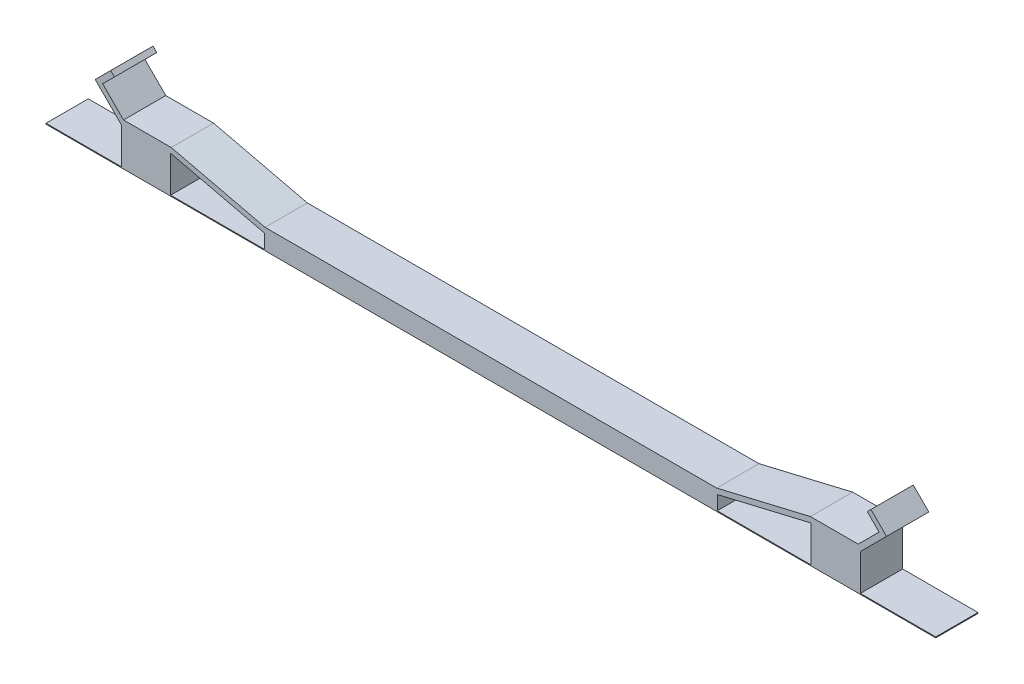
ISO-10303-21;
HEADER;
FILE_DESCRIPTION(('STEP AP214'),'2;1');
FILE_NAME('part.step','',(''),(''),'','','');
FILE_SCHEMA(('AUTOMOTIVE_DESIGN { 1 0 10303 214 1 1 1 1 }'));
ENDSEC;
DATA;
#1=APPLICATION_CONTEXT('core data for automotive mechanical design processes');
#2=APPLICATION_PROTOCOL_DEFINITION('international standard','automotive_design',2000,#1);
#3=PRODUCT_CONTEXT('',#1,'mechanical');
#4=PRODUCT('Part','Part','',(#3));
#5=PRODUCT_RELATED_PRODUCT_CATEGORY('part','',(#4));
#6=PRODUCT_DEFINITION_FORMATION('','',#4);
#7=PRODUCT_DEFINITION_CONTEXT('part definition',#1,'design');
#8=PRODUCT_DEFINITION('design','',#6,#7);
#9=PRODUCT_DEFINITION_SHAPE('','',#8);
#10=(LENGTH_UNIT() NAMED_UNIT(*) SI_UNIT(.MILLI.,.METRE.));
#11=(NAMED_UNIT(*) PLANE_ANGLE_UNIT() SI_UNIT($,.RADIAN.));
#12=(NAMED_UNIT(*) SI_UNIT($,.STERADIAN.) SOLID_ANGLE_UNIT());
#13=UNCERTAINTY_MEASURE_WITH_UNIT(LENGTH_MEASURE(1.E-05),#10,'distance_accuracy_value','');
#14=(GEOMETRIC_REPRESENTATION_CONTEXT(3) GLOBAL_UNCERTAINTY_ASSIGNED_CONTEXT((#13)) GLOBAL_UNIT_ASSIGNED_CONTEXT((#10,
#11,#12)) REPRESENTATION_CONTEXT('',''));
#15=CARTESIAN_POINT('',(0.,0.,0.));
#16=DIRECTION('',(0.,0.,1.));
#17=DIRECTION('',(1.,0.,0.));
#18=AXIS2_PLACEMENT_3D('',#15,#16,#17);
#19=CARTESIAN_POINT('',(0.,1.,0.));
#20=DIRECTION('',(0.,1.,0.));
#21=DIRECTION('',(0.,0.,1.));
#22=AXIS2_PLACEMENT_3D('',#19,#20,#21);
#23=PLANE('',#22);
#24=DIRECTION('',(0.,0.,-1.));
#25=VECTOR('',#24,1.);
#26=CARTESIAN_POINT('',(363.494906847952,1.,24.));
#27=LINE('',#26,#25);
#28=CARTESIAN_POINT('',(363.494906847952,1.,23.9999999999999));
#29=VERTEX_POINT('',#28);
#30=CARTESIAN_POINT('',(363.494906847952,1.,-24.));
#31=VERTEX_POINT('',#30);
#32=EDGE_CURVE('E343',#29,#31,#27,.T.);
#33=ORIENTED_EDGE('',*,*,#32,.T.);
#34=DIRECTION('',(-1.,0.,0.));
#35=VECTOR('',#34,1.);
#36=CARTESIAN_POINT('',(504.999999999999,1.,-24.0000000000001));
#37=LINE('',#36,#35);
#38=CARTESIAN_POINT('',(257.,1.,-24.));
#39=VERTEX_POINT('',#38);
#40=EDGE_CURVE('E453',#31,#39,#37,.T.);
#41=ORIENTED_EDGE('',*,*,#40,.T.);
#42=DIRECTION('',(0.,0.,-1.));
#43=VECTOR('',#42,1.);
#44=CARTESIAN_POINT('',(257.,1.,24.));
#45=LINE('',#44,#43);
#46=CARTESIAN_POINT('',(257.,1.,23.9999999999999));
#47=VERTEX_POINT('',#46);
#48=EDGE_CURVE('E419',#47,#39,#45,.T.);
#49=ORIENTED_EDGE('',*,*,#48,.F.);
#50=DIRECTION('',(1.,0.,0.));
#51=VECTOR('',#50,1.);
#52=CARTESIAN_POINT('',(504.999999999999,1.,23.9999999999999));
#53=LINE('',#52,#51);
#54=EDGE_CURVE('E448',#47,#29,#53,.T.);
#55=ORIENTED_EDGE('',*,*,#54,.T.);
#56=EDGE_LOOP('',(#33,#41,#49,#55));
#57=FACE_BOUND('',#56,.T.);
#58=ADVANCED_FACE('F37',(#57),#23,.T.);
#59=CARTESIAN_POINT('',(-257.,1.,-24.));
#60=VERTEX_POINT('',#59);
#61=CARTESIAN_POINT('',(-363.494906847952,1.,-24.));
#62=VERTEX_POINT('',#61);
#63=EDGE_CURVE('E454',#60,#62,#37,.T.);
#64=ORIENTED_EDGE('',*,*,#63,.T.);
#65=DIRECTION('',(0.,0.,-1.));
#66=VECTOR('',#65,1.);
#67=CARTESIAN_POINT('',(-363.494906847952,1.,24.));
#68=LINE('',#67,#66);
#69=CARTESIAN_POINT('',(-363.494906847952,1.,24.));
#70=VERTEX_POINT('',#69);
#71=EDGE_CURVE('E390',#70,#62,#68,.T.);
#72=ORIENTED_EDGE('',*,*,#71,.F.);
#73=CARTESIAN_POINT('',(-257.,1.,24.));
#74=VERTEX_POINT('',#73);
#75=EDGE_CURVE('E447',#70,#74,#53,.T.);
#76=ORIENTED_EDGE('',*,*,#75,.T.);
#77=DIRECTION('',(0.,0.,1.));
#78=VECTOR('',#77,1.);
#79=CARTESIAN_POINT('',(-257.,1.,24.));
#80=LINE('',#79,#78);
#81=EDGE_CURVE('E414',#60,#74,#80,.T.);
#82=ORIENTED_EDGE('',*,*,#81,.F.);
#83=EDGE_LOOP('',(#64,#72,#76,#82));
#84=FACE_BOUND('',#83,.T.);
#85=ADVANCED_FACE('F574',(#84),#23,.T.);
#86=CARTESIAN_POINT('',(-505.000000000001,1.,24.));
#87=VERTEX_POINT('',#86);
#88=CARTESIAN_POINT('',(-419.494906847952,1.,24.));
#89=VERTEX_POINT('',#88);
#90=EDGE_CURVE('E444',#87,#89,#53,.T.);
#91=ORIENTED_EDGE('',*,*,#90,.T.);
#92=DIRECTION('',(0.,0.,1.));
#93=VECTOR('',#92,1.);
#94=CARTESIAN_POINT('',(-419.494906847952,1.,24.));
#95=LINE('',#94,#93);
#96=CARTESIAN_POINT('',(-419.494906847952,1.,-24.));
#97=VERTEX_POINT('',#96);
#98=EDGE_CURVE('E395',#97,#89,#95,.T.);
#99=ORIENTED_EDGE('',*,*,#98,.F.);
#100=CARTESIAN_POINT('',(-505.000000000001,1.,-24.));
#101=VERTEX_POINT('',#100);
#102=EDGE_CURVE('E450',#97,#101,#37,.T.);
#103=ORIENTED_EDGE('',*,*,#102,.T.);
#104=DIRECTION('',(0.,0.,1.));
#105=VECTOR('',#104,1.);
#106=CARTESIAN_POINT('',(-505.000000000001,1.,24.));
#107=LINE('',#106,#105);
#108=EDGE_CURVE('E439',#101,#87,#107,.T.);
#109=ORIENTED_EDGE('',*,*,#108,.T.);
#110=EDGE_LOOP('',(#91,#99,#103,#109));
#111=FACE_BOUND('',#110,.T.);
#112=ADVANCED_FACE('F483',(#111),#23,.T.);
#113=CARTESIAN_POINT('',(-505.000000000001,1.,24.));
#114=DIRECTION('',(1.,0.,0.));
#115=DIRECTION('',(0.,0.,-1.));
#116=AXIS2_PLACEMENT_3D('',#113,#114,#115);
#117=PLANE('',#116);
#118=DIRECTION('',(0.,0.,1.));
#119=VECTOR('',#118,1.);
#120=CARTESIAN_POINT('',(-505.000000000001,0.,24.));
#121=LINE('',#120,#119);
#122=CARTESIAN_POINT('',(-505.000000000001,0.,-24.));
#123=VERTEX_POINT('',#122);
#124=CARTESIAN_POINT('',(-505.000000000001,0.,24.));
#125=VERTEX_POINT('',#124);
#126=EDGE_CURVE('E438',#123,#125,#121,.T.);
#127=ORIENTED_EDGE('',*,*,#126,.T.);
#128=DIRECTION('',(0.,-1.,0.));
#129=VECTOR('',#128,1.);
#130=CARTESIAN_POINT('',(-505.000000000001,1.,24.));
#131=LINE('',#130,#129);
#132=EDGE_CURVE('E11',#87,#125,#131,.T.);
#133=ORIENTED_EDGE('',*,*,#132,.F.);
#134=ORIENTED_EDGE('',*,*,#108,.F.);
#135=DIRECTION('',(0.,-1.,0.));
#136=VECTOR('',#135,1.);
#137=CARTESIAN_POINT('',(-505.000000000001,1.,-24.));
#138=LINE('',#137,#136);
#139=EDGE_CURVE('E452',#101,#123,#138,.T.);
#140=ORIENTED_EDGE('',*,*,#139,.T.);
#141=EDGE_LOOP('',(#127,#133,#134,#140));
#142=FACE_BOUND('',#141,.T.);
#143=ADVANCED_FACE('F39',(#142),#117,.F.);
#144=CARTESIAN_POINT('',(504.999999999999,1.,23.9999999999999));
#145=DIRECTION('',(0.,0.,-1.));
#146=DIRECTION('',(-1.,0.,0.));
#147=AXIS2_PLACEMENT_3D('',#144,#145,#146);
#148=PLANE('',#147);
#149=DIRECTION('',(0.,-1.,0.));
#150=VECTOR('',#149,1.);
#151=CARTESIAN_POINT('',(257.,17.,24.));
#152=LINE('',#151,#150);
#153=CARTESIAN_POINT('',(257.,17.,24.));
#154=VERTEX_POINT('',#153);
#155=EDGE_CURVE('E432',#154,#47,#152,.T.);
#156=ORIENTED_EDGE('',*,*,#155,.F.);
#157=DIRECTION('',(-0.973126331148455,-0.230271890654391,0.));
#158=VECTOR('',#157,1.);
#159=CARTESIAN_POINT('',(257.,17.,24.));
#160=LINE('',#159,#158);
#161=CARTESIAN_POINT('',(363.494906847952,42.2,24.));
#162=VERTEX_POINT('',#161);
#163=EDGE_CURVE('E313',#162,#154,#160,.T.);
#164=ORIENTED_EDGE('',*,*,#163,.F.);
#165=DIRECTION('',(0.,-1.,0.));
#166=VECTOR('',#165,1.);
#167=CARTESIAN_POINT('',(363.494906847952,42.2,24.));
#168=LINE('',#167,#166);
#169=EDGE_CURVE('E387',#162,#29,#168,.T.);
#170=ORIENTED_EDGE('',*,*,#169,.T.);
#171=ORIENTED_EDGE('',*,*,#54,.F.);
#172=EDGE_LOOP('',(#156,#164,#170,#171));
#173=FACE_BOUND('',#172,.T.);
#174=DIRECTION('',(0.,-1.,0.));
#175=VECTOR('',#174,1.);
#176=CARTESIAN_POINT('',(-363.494906847952,42.2,24.));
#177=LINE('',#176,#175);
#178=CARTESIAN_POINT('',(-363.494906847952,42.2,24.));
#179=VERTEX_POINT('',#178);
#180=EDGE_CURVE('E398',#179,#70,#177,.T.);
#181=ORIENTED_EDGE('',*,*,#180,.F.);
#182=DIRECTION('',(-0.973126331148455,0.230271890654391,0.));
#183=VECTOR('',#182,1.);
#184=CARTESIAN_POINT('',(-363.494906847952,42.2,24.));
#185=LINE('',#184,#183);
#186=CARTESIAN_POINT('',(-257.,17.,24.));
#187=VERTEX_POINT('',#186);
#188=EDGE_CURVE('E310',#187,#179,#185,.T.);
#189=ORIENTED_EDGE('',*,*,#188,.F.);
#190=DIRECTION('',(0.,-1.,0.));
#191=VECTOR('',#190,1.);
#192=CARTESIAN_POINT('',(-257.,17.,24.));
#193=LINE('',#192,#191);
#194=EDGE_CURVE('E435',#187,#74,#193,.T.);
#195=ORIENTED_EDGE('',*,*,#194,.T.);
#196=ORIENTED_EDGE('',*,*,#75,.F.);
#197=EDGE_LOOP('',(#181,#189,#195,#196));
#198=FACE_BOUND('',#197,.T.);
#199=DIRECTION('',(-0.707106781186548,0.707106781186547,0.));
#200=VECTOR('',#199,1.);
#201=CARTESIAN_POINT('',(-419.494906847952,42.2,24.));
#202=LINE('',#201,#200);
#203=CARTESIAN_POINT('',(-419.494906847952,42.2,24.));
#204=VERTEX_POINT('',#203);
#205=CARTESIAN_POINT('',(-449.193391657787,71.898484809835,24.));
#206=VERTEX_POINT('',#205);
#207=EDGE_CURVE('E308',#204,#206,#202,.T.);
#208=ORIENTED_EDGE('',*,*,#207,.F.);
#209=DIRECTION('',(0.,-1.,0.));
#210=VECTOR('',#209,1.);
#211=CARTESIAN_POINT('',(-419.494906847952,42.2,24.));
#212=LINE('',#211,#210);
#213=EDGE_CURVE('E405',#204,#89,#212,.T.);
#214=ORIENTED_EDGE('',*,*,#213,.T.);
#215=ORIENTED_EDGE('',*,*,#90,.F.);
#216=ORIENTED_EDGE('',*,*,#132,.T.);
#217=DIRECTION('',(1.,0.,0.));
#218=VECTOR('',#217,1.);
#219=CARTESIAN_POINT('',(504.999999999999,0.,23.9999999999999));
#220=LINE('',#219,#218);
#221=CARTESIAN_POINT('',(504.999999999999,0.,23.9999999999999));
#222=VERTEX_POINT('',#221);
#223=EDGE_CURVE('E457',#125,#222,#220,.T.);
#224=ORIENTED_EDGE('',*,*,#223,.T.);
#225=DIRECTION('',(0.,-1.,0.));
#226=VECTOR('',#225,1.);
#227=CARTESIAN_POINT('',(504.999999999999,1.,23.9999999999999));
#228=LINE('',#227,#226);
#229=CARTESIAN_POINT('',(504.999999999999,1.,23.9999999999999));
#230=VERTEX_POINT('',#229);
#231=EDGE_CURVE('E45',#230,#222,#228,.T.);
#232=ORIENTED_EDGE('',*,*,#231,.F.);
#233=CARTESIAN_POINT('',(419.494906847952,1.,23.9999999999999));
#234=VERTEX_POINT('',#233);
#235=EDGE_CURVE('E442',#234,#230,#53,.T.);
#236=ORIENTED_EDGE('',*,*,#235,.F.);
#237=DIRECTION('',(0.,-1.,0.));
#238=VECTOR('',#237,1.);
#239=CARTESIAN_POINT('',(419.494906847952,42.2,24.));
#240=LINE('',#239,#238);
#241=CARTESIAN_POINT('',(419.494906847952,42.2,24.));
#242=VERTEX_POINT('',#241);
#243=EDGE_CURVE('E384',#242,#234,#240,.T.);
#244=ORIENTED_EDGE('',*,*,#243,.F.);
#245=DIRECTION('',(-0.707106781186546,-0.707106781186549,0.));
#246=VECTOR('',#245,1.);
#247=CARTESIAN_POINT('',(419.494906847952,42.2,24.));
#248=LINE('',#247,#246);
#249=CARTESIAN_POINT('',(449.193391657787,71.898484809835,24.));
#250=VERTEX_POINT('',#249);
#251=EDGE_CURVE('E316',#250,#242,#248,.T.);
#252=ORIENTED_EDGE('',*,*,#251,.F.);
#253=DIRECTION('',(0.707106781186549,-0.707106781186546,0.));
#254=VECTOR('',#253,1.);
#255=CARTESIAN_POINT('',(449.193391657787,71.898484809835,24.));
#256=LINE('',#255,#254);
#257=CARTESIAN_POINT('',(431.515722128123,89.5761543394986,24.));
#258=VERTEX_POINT('',#257);
#259=EDGE_CURVE('E318',#258,#250,#256,.T.);
#260=ORIENTED_EDGE('',*,*,#259,.F.);
#261=DIRECTION('',(0.707106781186545,0.70710678118655,0.));
#262=VECTOR('',#261,1.);
#263=CARTESIAN_POINT('',(427.273081441004,85.3335136523793,24.));
#264=LINE('',#263,#262);
#265=CARTESIAN_POINT('',(427.273081441004,85.3335136523793,24.));
#266=VERTEX_POINT('',#265);
#267=EDGE_CURVE('E320',#266,#258,#264,.T.);
#268=ORIENTED_EDGE('',*,*,#267,.F.);
#269=DIRECTION('',(0.707106781186549,-0.707106781186546,0.));
#270=VECTOR('',#269,1.);
#271=CARTESIAN_POINT('',(444.950750970667,67.6558441227157,24.));
#272=LINE('',#271,#270);
#273=CARTESIAN_POINT('',(440.708110283548,71.898484809835,24.));
#274=VERTEX_POINT('',#273);
#275=EDGE_CURVE('E322',#266,#274,#272,.T.);
#276=ORIENTED_EDGE('',*,*,#275,.T.);
#277=DIRECTION('',(-0.707106781186546,-0.707106781186549,0.));
#278=VECTOR('',#277,1.);
#279=CARTESIAN_POINT('',(415.252266160832,46.4426406871193,24.));
#280=LINE('',#279,#278);
#281=CARTESIAN_POINT('',(417.009625473713,48.2,24.));
#282=VERTEX_POINT('',#281);
#283=EDGE_CURVE('E325',#274,#282,#280,.T.);
#284=ORIENTED_EDGE('',*,*,#283,.T.);
#285=DIRECTION('',(1.,0.,0.));
#286=VECTOR('',#285,1.);
#287=CARTESIAN_POINT('',(363.494906847952,48.2,24.));
#288=LINE('',#287,#286);
#289=CARTESIAN_POINT('',(362.794682375694,48.2,24.));
#290=VERTEX_POINT('',#289);
#291=EDGE_CURVE('E328',#282,#290,#288,.F.);
#292=ORIENTED_EDGE('',*,*,#291,.T.);
#293=DIRECTION('',(-0.973126331148455,-0.230271890654391,0.));
#294=VECTOR('',#293,1.);
#295=CARTESIAN_POINT('',(255.618368656074,22.8387579868907,24.));
#296=LINE('',#295,#294);
#297=CARTESIAN_POINT('',(256.299775527742,23.,24.));
#298=VERTEX_POINT('',#297);
#299=EDGE_CURVE('E331',#290,#298,#296,.T.);
#300=ORIENTED_EDGE('',*,*,#299,.T.);
#301=DIRECTION('',(1.,0.,0.));
#302=VECTOR('',#301,1.);
#303=CARTESIAN_POINT('',(-257.,23.,24.));
#304=LINE('',#303,#302);
#305=CARTESIAN_POINT('',(-256.299775527742,23.,24.));
#306=VERTEX_POINT('',#305);
#307=EDGE_CURVE('E334',#298,#306,#304,.F.);
#308=ORIENTED_EDGE('',*,*,#307,.T.);
#309=DIRECTION('',(-0.973126331148455,0.230271890654391,0.));
#310=VECTOR('',#309,1.);
#311=CARTESIAN_POINT('',(-362.113275504025,48.0387579868907,24.));
#312=LINE('',#311,#310);
#313=CARTESIAN_POINT('',(-362.794682375694,48.2,24.));
#314=VERTEX_POINT('',#313);
#315=EDGE_CURVE('E337',#306,#314,#312,.T.);
#316=ORIENTED_EDGE('',*,*,#315,.T.);
#317=DIRECTION('',(1.,0.,0.));
#318=VECTOR('',#317,1.);
#319=CARTESIAN_POINT('',(-419.494906847952,48.2,24.));
#320=LINE('',#319,#318);
#321=CARTESIAN_POINT('',(-417.009625473713,48.2,24.));
#322=VERTEX_POINT('',#321);
#323=EDGE_CURVE('E263',#314,#322,#320,.F.);
#324=ORIENTED_EDGE('',*,*,#323,.T.);
#325=DIRECTION('',(-0.707106781186548,0.707106781186547,0.));
#326=VECTOR('',#325,1.);
#327=CARTESIAN_POINT('',(-415.252266160832,46.4426406871193,24.));
#328=LINE('',#327,#326);
#329=CARTESIAN_POINT('',(-440.708110283548,71.898484809835,24.));
#330=VERTEX_POINT('',#329);
#331=EDGE_CURVE('E260',#322,#330,#328,.T.);
#332=ORIENTED_EDGE('',*,*,#331,.T.);
#333=DIRECTION('',(0.707106781186549,0.707106781186546,0.));
#334=VECTOR('',#333,1.);
#335=CARTESIAN_POINT('',(-444.950750970667,67.6558441227157,24.));
#336=LINE('',#335,#334);
#337=CARTESIAN_POINT('',(-427.273081441004,85.3335136523794,24.));
#338=VERTEX_POINT('',#337);
#339=EDGE_CURVE('E303',#330,#338,#336,.T.);
#340=ORIENTED_EDGE('',*,*,#339,.T.);
#341=DIRECTION('',(0.707106781186545,-0.70710678118655,0.));
#342=VECTOR('',#341,1.);
#343=CARTESIAN_POINT('',(-431.515722128123,89.5761543394987,24.));
#344=LINE('',#343,#342);
#345=CARTESIAN_POINT('',(-431.515722128123,89.5761543394987,24.));
#346=VERTEX_POINT('',#345);
#347=EDGE_CURVE('E251',#346,#338,#344,.T.);
#348=ORIENTED_EDGE('',*,*,#347,.F.);
#349=DIRECTION('',(0.707106781186549,0.707106781186546,0.));
#350=VECTOR('',#349,1.);
#351=CARTESIAN_POINT('',(-449.193391657787,71.898484809835,24.));
#352=LINE('',#351,#350);
#353=EDGE_CURVE('E306',#206,#346,#352,.T.);
#354=ORIENTED_EDGE('',*,*,#353,.F.);
#355=EDGE_LOOP('',(#208,#214,#215,#216,#224,#232,#236,#244,#252,#260,#268,#276,#284,#292,#300,
#308,#316,#324,#332,#340,#348,#354));
#356=FACE_BOUND('',#355,.T.);
#357=ADVANCED_FACE('F496',(#173,#198,#356),#148,.F.);
#358=CARTESIAN_POINT('',(504.999999999999,1.,23.9999999999999));
#359=DIRECTION('',(-1.,0.,0.));
#360=DIRECTION('',(0.,0.,1.));
#361=AXIS2_PLACEMENT_3D('',#358,#359,#360);
#362=PLANE('',#361);
#363=DIRECTION('',(0.,0.,-1.));
#364=VECTOR('',#363,1.);
#365=CARTESIAN_POINT('',(504.999999999999,0.,23.9999999999999));
#366=LINE('',#365,#364);
#367=CARTESIAN_POINT('',(504.999999999999,0.,-24.0000000000001));
#368=VERTEX_POINT('',#367);
#369=EDGE_CURVE('E459',#222,#368,#366,.T.);
#370=ORIENTED_EDGE('',*,*,#369,.T.);
#371=DIRECTION('',(0.,-1.,0.));
#372=VECTOR('',#371,1.);
#373=CARTESIAN_POINT('',(504.999999999999,1.,-24.0000000000001));
#374=LINE('',#373,#372);
#375=CARTESIAN_POINT('',(504.999999999999,1.,-24.0000000000001));
#376=VERTEX_POINT('',#375);
#377=EDGE_CURVE('E464',#376,#368,#374,.T.);
#378=ORIENTED_EDGE('',*,*,#377,.F.);
#379=DIRECTION('',(0.,0.,-1.));
#380=VECTOR('',#379,1.);
#381=CARTESIAN_POINT('',(504.999999999999,1.,23.9999999999999));
#382=LINE('',#381,#380);
#383=EDGE_CURVE('E446',#230,#376,#382,.T.);
#384=ORIENTED_EDGE('',*,*,#383,.F.);
#385=ORIENTED_EDGE('',*,*,#231,.T.);
#386=EDGE_LOOP('',(#370,#378,#384,#385));
#387=FACE_BOUND('',#386,.T.);
#388=ADVANCED_FACE('F471',(#387),#362,.F.);
#389=CARTESIAN_POINT('',(504.999999999999,1.,-24.0000000000001));
#390=DIRECTION('',(0.,0.,1.));
#391=DIRECTION('',(1.,0.,0.));
#392=AXIS2_PLACEMENT_3D('',#389,#390,#391);
#393=PLANE('',#392);
#394=DIRECTION('',(0.,-1.,0.));
#395=VECTOR('',#394,1.);
#396=CARTESIAN_POINT('',(-257.,17.,-24.));
#397=LINE('',#396,#395);
#398=CARTESIAN_POINT('',(-257.,17.,-24.));
#399=VERTEX_POINT('',#398);
#400=EDGE_CURVE('E422',#399,#60,#397,.T.);
#401=ORIENTED_EDGE('',*,*,#400,.F.);
#402=DIRECTION('',(-0.973126331148455,0.230271890654391,0.));
#403=VECTOR('',#402,1.);
#404=CARTESIAN_POINT('',(-363.494906847952,42.2,-24.));
#405=LINE('',#404,#403);
#406=CARTESIAN_POINT('',(-363.494906847952,42.2,-24.));
#407=VERTEX_POINT('',#406);
#408=EDGE_CURVE('E269',#399,#407,#405,.T.);
#409=ORIENTED_EDGE('',*,*,#408,.T.);
#410=DIRECTION('',(0.,-1.,0.));
#411=VECTOR('',#410,1.);
#412=CARTESIAN_POINT('',(-363.494906847952,42.2,-24.));
#413=LINE('',#412,#411);
#414=EDGE_CURVE('E411',#407,#62,#413,.T.);
#415=ORIENTED_EDGE('',*,*,#414,.T.);
#416=ORIENTED_EDGE('',*,*,#63,.F.);
#417=EDGE_LOOP('',(#401,#409,#415,#416));
#418=FACE_BOUND('',#417,.T.);
#419=DIRECTION('',(0.,-1.,0.));
#420=VECTOR('',#419,1.);
#421=CARTESIAN_POINT('',(-419.494906847952,42.2,-24.));
#422=LINE('',#421,#420);
#423=CARTESIAN_POINT('',(-419.494906847952,42.2,-24.));
#424=VERTEX_POINT('',#423);
#425=EDGE_CURVE('E408',#424,#97,#422,.T.);
#426=ORIENTED_EDGE('',*,*,#425,.F.);
#427=DIRECTION('',(-0.707106781186548,0.707106781186547,0.));
#428=VECTOR('',#427,1.);
#429=CARTESIAN_POINT('',(-419.494906847952,42.2,-24.));
#430=LINE('',#429,#428);
#431=CARTESIAN_POINT('',(-449.193391657787,71.898484809835,-24.));
#432=VERTEX_POINT('',#431);
#433=EDGE_CURVE('E267',#424,#432,#430,.T.);
#434=ORIENTED_EDGE('',*,*,#433,.T.);
#435=DIRECTION('',(0.707106781186549,0.707106781186546,0.));
#436=VECTOR('',#435,1.);
#437=CARTESIAN_POINT('',(-449.193391657787,71.898484809835,-24.));
#438=LINE('',#437,#436);
#439=CARTESIAN_POINT('',(-431.515722128123,89.5761543394987,-24.));
#440=VERTEX_POINT('',#439);
#441=EDGE_CURVE('E242',#432,#440,#438,.T.);
#442=ORIENTED_EDGE('',*,*,#441,.T.);
#443=DIRECTION('',(0.707106781186545,-0.70710678118655,0.));
#444=VECTOR('',#443,1.);
#445=CARTESIAN_POINT('',(-431.515722128123,89.5761543394987,-24.));
#446=LINE('',#445,#444);
#447=CARTESIAN_POINT('',(-427.273081441004,85.3335136523794,-24.));
#448=VERTEX_POINT('',#447);
#449=EDGE_CURVE('E233',#440,#448,#446,.T.);
#450=ORIENTED_EDGE('',*,*,#449,.T.);
#451=DIRECTION('',(0.707106781186549,0.707106781186546,0.));
#452=VECTOR('',#451,1.);
#453=CARTESIAN_POINT('',(-444.950750970667,67.6558441227157,-24.));
#454=LINE('',#453,#452);
#455=CARTESIAN_POINT('',(-440.708110283548,71.898484809835,-24.));
#456=VERTEX_POINT('',#455);
#457=EDGE_CURVE('E239',#456,#448,#454,.T.);
#458=ORIENTED_EDGE('',*,*,#457,.F.);
#459=DIRECTION('',(-0.707106781186548,0.707106781186547,0.));
#460=VECTOR('',#459,1.);
#461=CARTESIAN_POINT('',(-415.252266160832,46.4426406871193,-24.));
#462=LINE('',#461,#460);
#463=CARTESIAN_POINT('',(-417.009625473713,48.2,-24.));
#464=VERTEX_POINT('',#463);
#465=EDGE_CURVE('E256',#464,#456,#462,.T.);
#466=ORIENTED_EDGE('',*,*,#465,.F.);
#467=DIRECTION('',(1.,0.,0.));
#468=VECTOR('',#467,1.);
#469=CARTESIAN_POINT('',(-419.494906847952,48.2,-24.));
#470=LINE('',#469,#468);
#471=CARTESIAN_POINT('',(-362.794682375694,48.2,-24.));
#472=VERTEX_POINT('',#471);
#473=EDGE_CURVE('E299',#472,#464,#470,.F.);
#474=ORIENTED_EDGE('',*,*,#473,.F.);
#475=DIRECTION('',(-0.973126331148455,0.230271890654391,0.));
#476=VECTOR('',#475,1.);
#477=CARTESIAN_POINT('',(-362.113275504025,48.0387579868907,-24.));
#478=LINE('',#477,#476);
#479=CARTESIAN_POINT('',(-256.299775527742,23.,-24.));
#480=VERTEX_POINT('',#479);
#481=EDGE_CURVE('E296',#480,#472,#478,.T.);
#482=ORIENTED_EDGE('',*,*,#481,.F.);
#483=DIRECTION('',(1.,0.,0.));
#484=VECTOR('',#483,1.);
#485=CARTESIAN_POINT('',(-257.,23.,-24.));
#486=LINE('',#485,#484);
#487=CARTESIAN_POINT('',(256.299775527742,23.,-24.));
#488=VERTEX_POINT('',#487);
#489=EDGE_CURVE('E293',#488,#480,#486,.F.);
#490=ORIENTED_EDGE('',*,*,#489,.F.);
#491=DIRECTION('',(-0.973126331148455,-0.230271890654391,0.));
#492=VECTOR('',#491,1.);
#493=CARTESIAN_POINT('',(255.618368656074,22.8387579868907,-24.));
#494=LINE('',#493,#492);
#495=CARTESIAN_POINT('',(362.794682375694,48.2,-24.));
#496=VERTEX_POINT('',#495);
#497=EDGE_CURVE('E290',#496,#488,#494,.T.);
#498=ORIENTED_EDGE('',*,*,#497,.F.);
#499=DIRECTION('',(1.,0.,0.));
#500=VECTOR('',#499,1.);
#501=CARTESIAN_POINT('',(363.494906847952,48.2,-24.));
#502=LINE('',#501,#500);
#503=CARTESIAN_POINT('',(417.009625473713,48.2,-24.));
#504=VERTEX_POINT('',#503);
#505=EDGE_CURVE('E287',#504,#496,#502,.F.);
#506=ORIENTED_EDGE('',*,*,#505,.F.);
#507=DIRECTION('',(-0.707106781186546,-0.707106781186549,0.));
#508=VECTOR('',#507,1.);
#509=CARTESIAN_POINT('',(415.252266160832,46.4426406871193,-24.));
#510=LINE('',#509,#508);
#511=CARTESIAN_POINT('',(440.708110283548,71.898484809835,-24.));
#512=VERTEX_POINT('',#511);
#513=EDGE_CURVE('E284',#512,#504,#510,.T.);
#514=ORIENTED_EDGE('',*,*,#513,.F.);
#515=DIRECTION('',(0.707106781186549,-0.707106781186546,0.));
#516=VECTOR('',#515,1.);
#517=CARTESIAN_POINT('',(444.950750970667,67.6558441227157,-24.));
#518=LINE('',#517,#516);
#519=CARTESIAN_POINT('',(427.273081441004,85.3335136523793,-24.));
#520=VERTEX_POINT('',#519);
#521=EDGE_CURVE('E281',#520,#512,#518,.T.);
#522=ORIENTED_EDGE('',*,*,#521,.F.);
#523=DIRECTION('',(0.707106781186545,0.70710678118655,0.));
#524=VECTOR('',#523,1.);
#525=CARTESIAN_POINT('',(427.273081441004,85.3335136523793,-24.));
#526=LINE('',#525,#524);
#527=CARTESIAN_POINT('',(431.515722128123,89.5761543394986,-24.));
#528=VERTEX_POINT('',#527);
#529=EDGE_CURVE('E279',#520,#528,#526,.T.);
#530=ORIENTED_EDGE('',*,*,#529,.T.);
#531=DIRECTION('',(0.707106781186549,-0.707106781186546,0.));
#532=VECTOR('',#531,1.);
#533=CARTESIAN_POINT('',(449.193391657787,71.898484809835,-24.));
#534=LINE('',#533,#532);
#535=CARTESIAN_POINT('',(449.193391657787,71.898484809835,-24.));
#536=VERTEX_POINT('',#535);
#537=EDGE_CURVE('E277',#528,#536,#534,.T.);
#538=ORIENTED_EDGE('',*,*,#537,.T.);
#539=DIRECTION('',(-0.707106781186546,-0.707106781186549,0.));
#540=VECTOR('',#539,1.);
#541=CARTESIAN_POINT('',(419.494906847952,42.2,-24.));
#542=LINE('',#541,#540);
#543=CARTESIAN_POINT('',(419.494906847952,42.2,-24.));
#544=VERTEX_POINT('',#543);
#545=EDGE_CURVE('E275',#536,#544,#542,.T.);
#546=ORIENTED_EDGE('',*,*,#545,.T.);
#547=DIRECTION('',(0.,-1.,0.));
#548=VECTOR('',#547,1.);
#549=CARTESIAN_POINT('',(419.494906847952,42.2,-24.));
#550=LINE('',#549,#548);
#551=CARTESIAN_POINT('',(419.494906847952,1.,-24.0000000000001));
#552=VERTEX_POINT('',#551);
#553=EDGE_CURVE('E382',#544,#552,#550,.T.);
#554=ORIENTED_EDGE('',*,*,#553,.T.);
#555=EDGE_CURVE('E52',#376,#552,#37,.T.);
#556=ORIENTED_EDGE('',*,*,#555,.F.);
#557=ORIENTED_EDGE('',*,*,#377,.T.);
#558=DIRECTION('',(-1.,0.,0.));
#559=VECTOR('',#558,1.);
#560=CARTESIAN_POINT('',(504.999999999999,0.,-24.0000000000001));
#561=LINE('',#560,#559);
#562=EDGE_CURVE('E443',#368,#123,#561,.T.);
#563=ORIENTED_EDGE('',*,*,#562,.T.);
#564=ORIENTED_EDGE('',*,*,#139,.F.);
#565=ORIENTED_EDGE('',*,*,#102,.F.);
#566=EDGE_LOOP('',(#426,#434,#442,#450,#458,#466,#474,#482,#490,#498,#506,#514,#522,#530,#538,
#546,#554,#556,#557,#563,#564,#565));
#567=FACE_BOUND('',#566,.T.);
#568=DIRECTION('',(-0.973126331148455,-0.230271890654391,0.));
#569=VECTOR('',#568,1.);
#570=CARTESIAN_POINT('',(257.,17.,-24.));
#571=LINE('',#570,#569);
#572=CARTESIAN_POINT('',(363.494906847952,42.2,-24.));
#573=VERTEX_POINT('',#572);
#574=CARTESIAN_POINT('',(257.,17.,-24.));
#575=VERTEX_POINT('',#574);
#576=EDGE_CURVE('E272',#573,#575,#571,.T.);
#577=ORIENTED_EDGE('',*,*,#576,.T.);
#578=DIRECTION('',(0.,-1.,0.));
#579=VECTOR('',#578,1.);
#580=CARTESIAN_POINT('',(257.,17.,-24.));
#581=LINE('',#580,#579);
#582=EDGE_CURVE('E429',#575,#39,#581,.T.);
#583=ORIENTED_EDGE('',*,*,#582,.T.);
#584=ORIENTED_EDGE('',*,*,#40,.F.);
#585=DIRECTION('',(0.,-1.,0.));
#586=VECTOR('',#585,1.);
#587=CARTESIAN_POINT('',(363.494906847952,42.2,-24.));
#588=LINE('',#587,#586);
#589=EDGE_CURVE('E376',#573,#31,#588,.T.);
#590=ORIENTED_EDGE('',*,*,#589,.F.);
#591=EDGE_LOOP('',(#577,#583,#584,#590));
#592=FACE_BOUND('',#591,.T.);
#593=ADVANCED_FACE('F235',(#418,#567,#592),#393,.F.);
#594=DIRECTION('',(0.,0.,1.));
#595=VECTOR('',#594,1.);
#596=CARTESIAN_POINT('',(419.494906847952,1.,24.));
#597=LINE('',#596,#595);
#598=EDGE_CURVE('E57',#552,#234,#597,.T.);
#599=ORIENTED_EDGE('',*,*,#598,.T.);
#600=ORIENTED_EDGE('',*,*,#235,.T.);
#601=ORIENTED_EDGE('',*,*,#383,.T.);
#602=ORIENTED_EDGE('',*,*,#555,.T.);
#603=EDGE_LOOP('',(#599,#600,#601,#602));
#604=FACE_BOUND('',#603,.T.);
#605=ADVANCED_FACE('F499',(#604),#23,.T.);
#606=CARTESIAN_POINT('',(0.,0.,0.));
#607=DIRECTION('',(0.,1.,0.));
#608=DIRECTION('',(0.,0.,1.));
#609=AXIS2_PLACEMENT_3D('',#606,#607,#608);
#610=PLANE('',#609);
#611=ORIENTED_EDGE('',*,*,#126,.F.);
#612=ORIENTED_EDGE('',*,*,#562,.F.);
#613=ORIENTED_EDGE('',*,*,#369,.F.);
#614=ORIENTED_EDGE('',*,*,#223,.F.);
#615=EDGE_LOOP('',(#611,#612,#613,#614));
#616=FACE_BOUND('',#615,.T.);
#617=ADVANCED_FACE('F477',(#616),#610,.F.);
#618=CARTESIAN_POINT('',(-257.,17.,24.));
#619=DIRECTION('',(1.,0.,0.));
#620=DIRECTION('',(0.,0.,-1.));
#621=AXIS2_PLACEMENT_3D('',#618,#619,#620);
#622=PLANE('',#621);
#623=ORIENTED_EDGE('',*,*,#81,.T.);
#624=ORIENTED_EDGE('',*,*,#194,.F.);
#625=DIRECTION('',(0.,0.,1.));
#626=VECTOR('',#625,1.);
#627=CARTESIAN_POINT('',(-257.,17.,24.));
#628=LINE('',#627,#626);
#629=EDGE_CURVE('E415',#399,#187,#628,.T.);
#630=ORIENTED_EDGE('',*,*,#629,.F.);
#631=ORIENTED_EDGE('',*,*,#400,.T.);
#632=EDGE_LOOP('',(#623,#624,#630,#631));
#633=FACE_BOUND('',#632,.T.);
#634=ADVANCED_FACE('F587',(#633),#622,.F.);
#635=CARTESIAN_POINT('',(257.,17.,24.));
#636=DIRECTION('',(-1.,0.,0.));
#637=DIRECTION('',(0.,0.,1.));
#638=AXIS2_PLACEMENT_3D('',#635,#636,#637);
#639=PLANE('',#638);
#640=ORIENTED_EDGE('',*,*,#48,.T.);
#641=ORIENTED_EDGE('',*,*,#582,.F.);
#642=DIRECTION('',(0.,0.,-1.));
#643=VECTOR('',#642,1.);
#644=CARTESIAN_POINT('',(257.,17.,24.));
#645=LINE('',#644,#643);
#646=EDGE_CURVE('E418',#154,#575,#645,.T.);
#647=ORIENTED_EDGE('',*,*,#646,.F.);
#648=ORIENTED_EDGE('',*,*,#155,.T.);
#649=EDGE_LOOP('',(#640,#641,#647,#648));
#650=FACE_BOUND('',#649,.T.);
#651=ADVANCED_FACE('F490',(#650),#639,.F.);
#652=CARTESIAN_POINT('',(-363.494906847952,42.2,24.));
#653=DIRECTION('',(-1.,0.,0.));
#654=DIRECTION('',(0.,0.,1.));
#655=AXIS2_PLACEMENT_3D('',#652,#653,#654);
#656=PLANE('',#655);
#657=ORIENTED_EDGE('',*,*,#71,.T.);
#658=ORIENTED_EDGE('',*,*,#414,.F.);
#659=DIRECTION('',(0.,0.,-1.));
#660=VECTOR('',#659,1.);
#661=CARTESIAN_POINT('',(-363.494906847952,42.2,24.));
#662=LINE('',#661,#660);
#663=EDGE_CURVE('E391',#179,#407,#662,.T.);
#664=ORIENTED_EDGE('',*,*,#663,.F.);
#665=ORIENTED_EDGE('',*,*,#180,.T.);
#666=EDGE_LOOP('',(#657,#658,#664,#665));
#667=FACE_BOUND('',#666,.T.);
#668=ADVANCED_FACE('F563',(#667),#656,.F.);
#669=CARTESIAN_POINT('',(-419.494906847952,42.2,24.));
#670=DIRECTION('',(1.,0.,0.));
#671=DIRECTION('',(0.,0.,-1.));
#672=AXIS2_PLACEMENT_3D('',#669,#670,#671);
#673=PLANE('',#672);
#674=ORIENTED_EDGE('',*,*,#98,.T.);
#675=ORIENTED_EDGE('',*,*,#213,.F.);
#676=DIRECTION('',(0.,0.,1.));
#677=VECTOR('',#676,1.);
#678=CARTESIAN_POINT('',(-419.494906847952,42.2,24.));
#679=LINE('',#678,#677);
#680=EDGE_CURVE('E394',#424,#204,#679,.T.);
#681=ORIENTED_EDGE('',*,*,#680,.F.);
#682=ORIENTED_EDGE('',*,*,#425,.T.);
#683=EDGE_LOOP('',(#674,#675,#681,#682));
#684=FACE_BOUND('',#683,.T.);
#685=ADVANCED_FACE('F560',(#684),#673,.F.);
#686=CARTESIAN_POINT('',(363.494906847952,42.2,24.));
#687=DIRECTION('',(-1.,0.,0.));
#688=DIRECTION('',(0.,0.,1.));
#689=AXIS2_PLACEMENT_3D('',#686,#687,#688);
#690=PLANE('',#689);
#691=ORIENTED_EDGE('',*,*,#32,.F.);
#692=ORIENTED_EDGE('',*,*,#169,.F.);
#693=DIRECTION('',(0.,0.,-1.));
#694=VECTOR('',#693,1.);
#695=CARTESIAN_POINT('',(363.494906847952,42.2,24.));
#696=LINE('',#695,#694);
#697=EDGE_CURVE('E370',#162,#573,#696,.T.);
#698=ORIENTED_EDGE('',*,*,#697,.T.);
#699=ORIENTED_EDGE('',*,*,#589,.T.);
#700=EDGE_LOOP('',(#691,#692,#698,#699));
#701=FACE_BOUND('',#700,.T.);
#702=ADVANCED_FACE('F562',(#701),#690,.T.);
#703=CARTESIAN_POINT('',(419.494906847952,42.2,24.));
#704=DIRECTION('',(1.,0.,0.));
#705=DIRECTION('',(0.,0.,-1.));
#706=AXIS2_PLACEMENT_3D('',#703,#704,#705);
#707=PLANE('',#706);
#708=ORIENTED_EDGE('',*,*,#598,.F.);
#709=ORIENTED_EDGE('',*,*,#553,.F.);
#710=DIRECTION('',(0.,0.,1.));
#711=VECTOR('',#710,1.);
#712=CARTESIAN_POINT('',(419.494906847952,42.2,24.));
#713=LINE('',#712,#711);
#714=EDGE_CURVE('E373',#544,#242,#713,.T.);
#715=ORIENTED_EDGE('',*,*,#714,.T.);
#716=ORIENTED_EDGE('',*,*,#243,.T.);
#717=EDGE_LOOP('',(#708,#709,#715,#716));
#718=FACE_BOUND('',#717,.T.);
#719=ADVANCED_FACE('F504',(#718),#707,.T.);
#720=CARTESIAN_POINT('',(-444.950750970667,67.6558441227157,-24.));
#721=DIRECTION('',(0.707106781186546,-0.707106781186549,0.));
#722=DIRECTION('',(0.707106781186549,0.707106781186546,0.));
#723=AXIS2_PLACEMENT_3D('',#720,#721,#722);
#724=PLANE('',#723);
#725=ORIENTED_EDGE('',*,*,#339,.F.);
#726=DIRECTION('',(0.,0.,1.));
#727=VECTOR('',#726,1.);
#728=CARTESIAN_POINT('',(-440.708110283548,71.898484809835,-24.));
#729=LINE('',#728,#727);
#730=EDGE_CURVE('E259',#456,#330,#729,.T.);
#731=ORIENTED_EDGE('',*,*,#730,.F.);
#732=ORIENTED_EDGE('',*,*,#457,.T.);
#733=DIRECTION('',(0.,0.,1.));
#734=VECTOR('',#733,1.);
#735=CARTESIAN_POINT('',(-427.273081441004,85.3335136523794,-24.));
#736=LINE('',#735,#734);
#737=EDGE_CURVE('E248',#448,#338,#736,.T.);
#738=ORIENTED_EDGE('',*,*,#737,.T.);
#739=EDGE_LOOP('',(#725,#731,#732,#738));
#740=FACE_BOUND('',#739,.T.);
#741=ADVANCED_FACE('F258',(#740),#724,.T.);
#742=CARTESIAN_POINT('',(-415.252266160832,46.4426406871193,-24.));
#743=DIRECTION('',(0.707106781186547,0.707106781186548,0.));
#744=DIRECTION('',(-0.707106781186548,0.707106781186547,0.));
#745=AXIS2_PLACEMENT_3D('',#742,#743,#744);
#746=PLANE('',#745);
#747=ORIENTED_EDGE('',*,*,#331,.F.);
#748=DIRECTION('',(0.,0.,1.));
#749=VECTOR('',#748,1.);
#750=CARTESIAN_POINT('',(-417.009625473713,48.2,-24.));
#751=LINE('',#750,#749);
#752=EDGE_CURVE('E344',#464,#322,#751,.T.);
#753=ORIENTED_EDGE('',*,*,#752,.F.);
#754=ORIENTED_EDGE('',*,*,#465,.T.);
#755=ORIENTED_EDGE('',*,*,#730,.T.);
#756=EDGE_LOOP('',(#747,#753,#754,#755));
#757=FACE_BOUND('',#756,.T.);
#758=ADVANCED_FACE('F550',(#757),#746,.T.);
#759=CARTESIAN_POINT('',(-419.494906847952,48.2,-24.));
#760=DIRECTION('',(0.,1.,0.));
#761=DIRECTION('',(0.,0.,1.));
#762=AXIS2_PLACEMENT_3D('',#759,#760,#761);
#763=PLANE('',#762);
#764=ORIENTED_EDGE('',*,*,#323,.F.);
#765=DIRECTION('',(0.,0.,1.));
#766=VECTOR('',#765,1.);
#767=CARTESIAN_POINT('',(-362.794682375694,48.2,-24.));
#768=LINE('',#767,#766);
#769=EDGE_CURVE('E346',#472,#314,#768,.T.);
#770=ORIENTED_EDGE('',*,*,#769,.F.);
#771=ORIENTED_EDGE('',*,*,#473,.T.);
#772=ORIENTED_EDGE('',*,*,#752,.T.);
#773=EDGE_LOOP('',(#764,#770,#771,#772));
#774=FACE_BOUND('',#773,.T.);
#775=ADVANCED_FACE('F547',(#774),#763,.T.);
#776=CARTESIAN_POINT('',(-362.113275504025,48.0387579868907,-24.));
#777=DIRECTION('',(0.230271890654391,0.973126331148455,0.));
#778=DIRECTION('',(-0.973126331148455,0.230271890654391,0.));
#779=AXIS2_PLACEMENT_3D('',#776,#777,#778);
#780=PLANE('',#779);
#781=ORIENTED_EDGE('',*,*,#315,.F.);
#782=DIRECTION('',(0.,0.,1.));
#783=VECTOR('',#782,1.);
#784=CARTESIAN_POINT('',(-256.299775527742,23.,-24.));
#785=LINE('',#784,#783);
#786=EDGE_CURVE('E348',#480,#306,#785,.T.);
#787=ORIENTED_EDGE('',*,*,#786,.F.);
#788=ORIENTED_EDGE('',*,*,#481,.T.);
#789=ORIENTED_EDGE('',*,*,#769,.T.);
#790=EDGE_LOOP('',(#781,#787,#788,#789));
#791=FACE_BOUND('',#790,.T.);
#792=ADVANCED_FACE('F543',(#791),#780,.T.);
#793=CARTESIAN_POINT('',(-257.,23.,-24.));
#794=DIRECTION('',(0.,1.,0.));
#795=DIRECTION('',(0.,0.,1.));
#796=AXIS2_PLACEMENT_3D('',#793,#794,#795);
#797=PLANE('',#796);
#798=ORIENTED_EDGE('',*,*,#307,.F.);
#799=DIRECTION('',(0.,0.,1.));
#800=VECTOR('',#799,1.);
#801=CARTESIAN_POINT('',(256.299775527742,23.,-24.));
#802=LINE('',#801,#800);
#803=EDGE_CURVE('E350',#488,#298,#802,.T.);
#804=ORIENTED_EDGE('',*,*,#803,.F.);
#805=ORIENTED_EDGE('',*,*,#489,.T.);
#806=ORIENTED_EDGE('',*,*,#786,.T.);
#807=EDGE_LOOP('',(#798,#804,#805,#806));
#808=FACE_BOUND('',#807,.T.);
#809=ADVANCED_FACE('F539',(#808),#797,.T.);
#810=CARTESIAN_POINT('',(255.618368656074,22.8387579868907,-24.));
#811=DIRECTION('',(-0.230271890654391,0.973126331148455,0.));
#812=DIRECTION('',(-0.973126331148455,-0.230271890654391,0.));
#813=AXIS2_PLACEMENT_3D('',#810,#811,#812);
#814=PLANE('',#813);
#815=ORIENTED_EDGE('',*,*,#299,.F.);
#816=DIRECTION('',(0.,0.,1.));
#817=VECTOR('',#816,1.);
#818=CARTESIAN_POINT('',(362.794682375694,48.2,-24.));
#819=LINE('',#818,#817);
#820=EDGE_CURVE('E352',#496,#290,#819,.T.);
#821=ORIENTED_EDGE('',*,*,#820,.F.);
#822=ORIENTED_EDGE('',*,*,#497,.T.);
#823=ORIENTED_EDGE('',*,*,#803,.T.);
#824=EDGE_LOOP('',(#815,#821,#822,#823));
#825=FACE_BOUND('',#824,.T.);
#826=ADVANCED_FACE('F535',(#825),#814,.T.);
#827=CARTESIAN_POINT('',(363.494906847952,48.2,-24.));
#828=DIRECTION('',(0.,1.,0.));
#829=DIRECTION('',(0.,0.,1.));
#830=AXIS2_PLACEMENT_3D('',#827,#828,#829);
#831=PLANE('',#830);
#832=ORIENTED_EDGE('',*,*,#291,.F.);
#833=DIRECTION('',(0.,0.,1.));
#834=VECTOR('',#833,1.);
#835=CARTESIAN_POINT('',(417.009625473713,48.2,-24.));
#836=LINE('',#835,#834);
#837=EDGE_CURVE('E354',#504,#282,#836,.T.);
#838=ORIENTED_EDGE('',*,*,#837,.F.);
#839=ORIENTED_EDGE('',*,*,#505,.T.);
#840=ORIENTED_EDGE('',*,*,#820,.T.);
#841=EDGE_LOOP('',(#832,#838,#839,#840));
#842=FACE_BOUND('',#841,.T.);
#843=ADVANCED_FACE('F531',(#842),#831,.T.);
#844=CARTESIAN_POINT('',(415.252266160832,46.4426406871193,-24.));
#845=DIRECTION('',(-0.707106781186549,0.707106781186546,0.));
#846=DIRECTION('',(-0.707106781186546,-0.707106781186549,0.));
#847=AXIS2_PLACEMENT_3D('',#844,#845,#846);
#848=PLANE('',#847);
#849=ORIENTED_EDGE('',*,*,#283,.F.);
#850=DIRECTION('',(0.,0.,1.));
#851=VECTOR('',#850,1.);
#852=CARTESIAN_POINT('',(440.708110283548,71.898484809835,-24.));
#853=LINE('',#852,#851);
#854=EDGE_CURVE('E356',#512,#274,#853,.T.);
#855=ORIENTED_EDGE('',*,*,#854,.F.);
#856=ORIENTED_EDGE('',*,*,#513,.T.);
#857=ORIENTED_EDGE('',*,*,#837,.T.);
#858=EDGE_LOOP('',(#849,#855,#856,#857));
#859=FACE_BOUND('',#858,.T.);
#860=ADVANCED_FACE('F527',(#859),#848,.T.);
#861=CARTESIAN_POINT('',(444.950750970667,67.6558441227157,-24.));
#862=DIRECTION('',(-0.707106781186546,-0.707106781186549,0.));
#863=DIRECTION('',(0.707106781186549,-0.707106781186546,0.));
#864=AXIS2_PLACEMENT_3D('',#861,#862,#863);
#865=PLANE('',#864);
#866=ORIENTED_EDGE('',*,*,#275,.F.);
#867=DIRECTION('',(0.,0.,1.));
#868=VECTOR('',#867,1.);
#869=CARTESIAN_POINT('',(427.273081441004,85.3335136523793,-24.));
#870=LINE('',#869,#868);
#871=EDGE_CURVE('E358',#520,#266,#870,.T.);
#872=ORIENTED_EDGE('',*,*,#871,.F.);
#873=ORIENTED_EDGE('',*,*,#521,.T.);
#874=ORIENTED_EDGE('',*,*,#854,.T.);
#875=EDGE_LOOP('',(#866,#872,#873,#874));
#876=FACE_BOUND('',#875,.T.);
#877=ADVANCED_FACE('F523',(#876),#865,.T.);
#878=CARTESIAN_POINT('',(427.273081441004,85.3335136523793,-24.));
#879=DIRECTION('',(0.70710678118655,-0.707106781186545,0.));
#880=DIRECTION('',(0.707106781186545,0.70710678118655,0.));
#881=AXIS2_PLACEMENT_3D('',#878,#879,#880);
#882=PLANE('',#881);
#883=ORIENTED_EDGE('',*,*,#267,.T.);
#884=DIRECTION('',(0.,0.,1.));
#885=VECTOR('',#884,1.);
#886=CARTESIAN_POINT('',(431.515722128123,89.5761543394986,-24.));
#887=LINE('',#886,#885);
#888=EDGE_CURVE('E360',#528,#258,#887,.T.);
#889=ORIENTED_EDGE('',*,*,#888,.F.);
#890=ORIENTED_EDGE('',*,*,#529,.F.);
#891=ORIENTED_EDGE('',*,*,#871,.T.);
#892=EDGE_LOOP('',(#883,#889,#890,#891));
#893=FACE_BOUND('',#892,.T.);
#894=ADVANCED_FACE('F520',(#893),#882,.F.);
#895=CARTESIAN_POINT('',(449.193391657787,71.898484809835,-24.));
#896=DIRECTION('',(-0.707106781186546,-0.707106781186549,0.));
#897=DIRECTION('',(0.707106781186549,-0.707106781186546,0.));
#898=AXIS2_PLACEMENT_3D('',#895,#896,#897);
#899=PLANE('',#898);
#900=ORIENTED_EDGE('',*,*,#259,.T.);
#901=DIRECTION('',(0.,0.,1.));
#902=VECTOR('',#901,1.);
#903=CARTESIAN_POINT('',(449.193391657787,71.898484809835,-24.));
#904=LINE('',#903,#902);
#905=EDGE_CURVE('E363',#536,#250,#904,.T.);
#906=ORIENTED_EDGE('',*,*,#905,.F.);
#907=ORIENTED_EDGE('',*,*,#537,.F.);
#908=ORIENTED_EDGE('',*,*,#888,.T.);
#909=EDGE_LOOP('',(#900,#906,#907,#908));
#910=FACE_BOUND('',#909,.T.);
#911=ADVANCED_FACE('F515',(#910),#899,.F.);
#912=CARTESIAN_POINT('',(419.494906847952,42.2,-24.));
#913=DIRECTION('',(-0.707106781186549,0.707106781186546,0.));
#914=DIRECTION('',(-0.707106781186546,-0.707106781186549,0.));
#915=AXIS2_PLACEMENT_3D('',#912,#913,#914);
#916=PLANE('',#915);
#917=ORIENTED_EDGE('',*,*,#251,.T.);
#918=ORIENTED_EDGE('',*,*,#714,.F.);
#919=ORIENTED_EDGE('',*,*,#545,.F.);
#920=ORIENTED_EDGE('',*,*,#905,.T.);
#921=EDGE_LOOP('',(#917,#918,#919,#920));
#922=FACE_BOUND('',#921,.T.);
#923=ADVANCED_FACE('F509',(#922),#916,.F.);
#924=CARTESIAN_POINT('',(257.,17.,-24.));
#925=DIRECTION('',(-0.230271890654391,0.973126331148455,0.));
#926=DIRECTION('',(-0.973126331148455,-0.230271890654391,0.));
#927=AXIS2_PLACEMENT_3D('',#924,#925,#926);
#928=PLANE('',#927);
#929=ORIENTED_EDGE('',*,*,#163,.T.);
#930=ORIENTED_EDGE('',*,*,#646,.T.);
#931=ORIENTED_EDGE('',*,*,#576,.F.);
#932=ORIENTED_EDGE('',*,*,#697,.F.);
#933=EDGE_LOOP('',(#929,#930,#931,#932));
#934=FACE_BOUND('',#933,.T.);
#935=ADVANCED_FACE('F494',(#934),#928,.F.);
#936=CARTESIAN_POINT('',(-363.494906847952,42.2,-24.));
#937=DIRECTION('',(0.230271890654391,0.973126331148455,0.));
#938=DIRECTION('',(-0.973126331148455,0.230271890654391,0.));
#939=AXIS2_PLACEMENT_3D('',#936,#937,#938);
#940=PLANE('',#939);
#941=ORIENTED_EDGE('',*,*,#188,.T.);
#942=ORIENTED_EDGE('',*,*,#663,.T.);
#943=ORIENTED_EDGE('',*,*,#408,.F.);
#944=ORIENTED_EDGE('',*,*,#629,.T.);
#945=EDGE_LOOP('',(#941,#942,#943,#944));
#946=FACE_BOUND('',#945,.T.);
#947=ADVANCED_FACE('F760',(#946),#940,.F.);
#948=CARTESIAN_POINT('',(-419.494906847952,42.2,-24.));
#949=DIRECTION('',(0.707106781186547,0.707106781186548,0.));
#950=DIRECTION('',(-0.707106781186548,0.707106781186547,0.));
#951=AXIS2_PLACEMENT_3D('',#948,#949,#950);
#952=PLANE('',#951);
#953=ORIENTED_EDGE('',*,*,#207,.T.);
#954=DIRECTION('',(0.,0.,1.));
#955=VECTOR('',#954,1.);
#956=CARTESIAN_POINT('',(-449.193391657787,71.898484809835,-24.));
#957=LINE('',#956,#955);
#958=EDGE_CURVE('E366',#432,#206,#957,.T.);
#959=ORIENTED_EDGE('',*,*,#958,.F.);
#960=ORIENTED_EDGE('',*,*,#433,.F.);
#961=ORIENTED_EDGE('',*,*,#680,.T.);
#962=EDGE_LOOP('',(#953,#959,#960,#961));
#963=FACE_BOUND('',#962,.T.);
#964=ADVANCED_FACE('F557',(#963),#952,.F.);
#965=CARTESIAN_POINT('',(-449.193391657787,71.898484809835,-24.));
#966=DIRECTION('',(0.707106781186546,-0.707106781186549,0.));
#967=DIRECTION('',(0.707106781186549,0.707106781186546,0.));
#968=AXIS2_PLACEMENT_3D('',#965,#966,#967);
#969=PLANE('',#968);
#970=ORIENTED_EDGE('',*,*,#353,.T.);
#971=DIRECTION('',(0.,0.,1.));
#972=VECTOR('',#971,1.);
#973=CARTESIAN_POINT('',(-431.515722128123,89.5761543394987,-24.));
#974=LINE('',#973,#972);
#975=EDGE_CURVE('E255',#440,#346,#974,.T.);
#976=ORIENTED_EDGE('',*,*,#975,.F.);
#977=ORIENTED_EDGE('',*,*,#441,.F.);
#978=ORIENTED_EDGE('',*,*,#958,.T.);
#979=EDGE_LOOP('',(#970,#976,#977,#978));
#980=FACE_BOUND('',#979,.T.);
#981=ADVANCED_FACE('F553',(#980),#969,.F.);
#982=CARTESIAN_POINT('',(-431.515722128123,89.5761543394987,-24.));
#983=DIRECTION('',(-0.70710678118655,-0.707106781186545,0.));
#984=DIRECTION('',(0.707106781186545,-0.70710678118655,0.));
#985=AXIS2_PLACEMENT_3D('',#982,#983,#984);
#986=PLANE('',#985);
#987=ORIENTED_EDGE('',*,*,#347,.T.);
#988=ORIENTED_EDGE('',*,*,#737,.F.);
#989=ORIENTED_EDGE('',*,*,#449,.F.);
#990=ORIENTED_EDGE('',*,*,#975,.T.);
#991=EDGE_LOOP('',(#987,#988,#989,#990));
#992=FACE_BOUND('',#991,.T.);
#993=ADVANCED_FACE('F249',(#992),#986,.F.);
#994=CLOSED_SHELL('',(#58,#85,#112,#143,#357,#388,#593,#605,#617,#634,#651,#668,#685,#702,#719,
#741,#758,#775,#792,#809,#826,#843,#860,#877,#894,#911,#923,#935,#947,#964,#981,#993));
#995=MANIFOLD_SOLID_BREP('B2',#994);
#996=ADVANCED_BREP_SHAPE_REPRESENTATION('',(#18,#995),#14);
#997=SHAPE_DEFINITION_REPRESENTATION(#9,#996);
ENDSEC;
END-ISO-10303-21;
